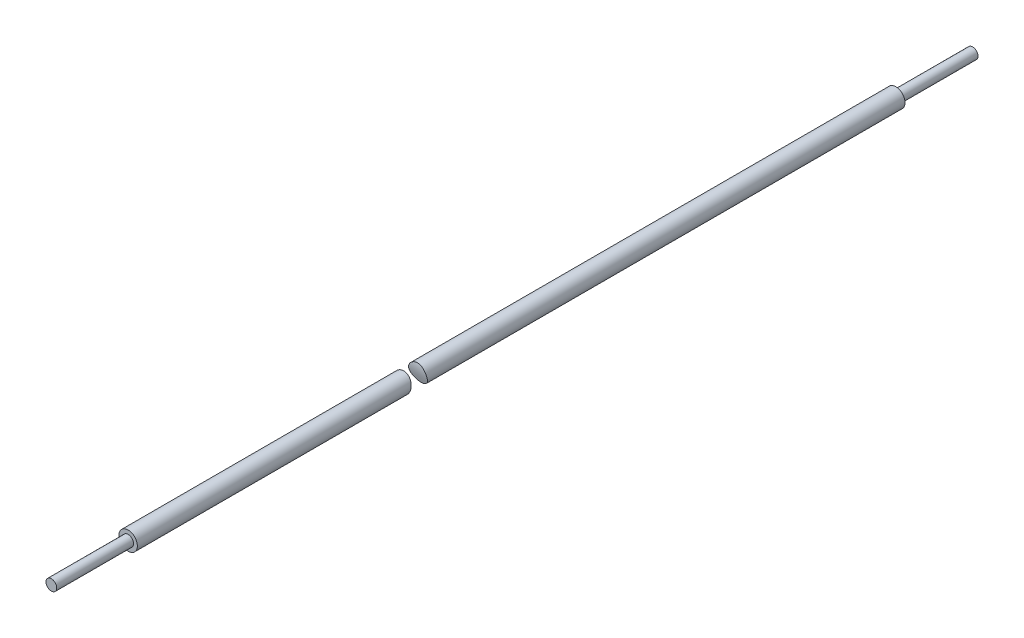
ISO-10303-21;
HEADER;
FILE_DESCRIPTION(('STEP AP214'),'2;1');
FILE_NAME('part.step','',(''),(''),'','','');
FILE_SCHEMA(('AUTOMOTIVE_DESIGN { 1 0 10303 214 1 1 1 1 }'));
ENDSEC;
DATA;
#1=APPLICATION_CONTEXT('core data for automotive mechanical design processes');
#2=APPLICATION_PROTOCOL_DEFINITION('international standard','automotive_design',2000,#1);
#3=PRODUCT_CONTEXT('',#1,'mechanical');
#4=PRODUCT('Part','Part','',(#3));
#5=PRODUCT_RELATED_PRODUCT_CATEGORY('part','',(#4));
#6=PRODUCT_DEFINITION_FORMATION('','',#4);
#7=PRODUCT_DEFINITION_CONTEXT('part definition',#1,'design');
#8=PRODUCT_DEFINITION('design','',#6,#7);
#9=PRODUCT_DEFINITION_SHAPE('','',#8);
#10=(LENGTH_UNIT() NAMED_UNIT(*) SI_UNIT(.MILLI.,.METRE.));
#11=(NAMED_UNIT(*) PLANE_ANGLE_UNIT() SI_UNIT($,.RADIAN.));
#12=(NAMED_UNIT(*) SI_UNIT($,.STERADIAN.) SOLID_ANGLE_UNIT());
#13=UNCERTAINTY_MEASURE_WITH_UNIT(LENGTH_MEASURE(1.E-05),#10,'distance_accuracy_value','');
#14=(GEOMETRIC_REPRESENTATION_CONTEXT(3) GLOBAL_UNCERTAINTY_ASSIGNED_CONTEXT((#13)) GLOBAL_UNIT_ASSIGNED_CONTEXT((#10,
#11,#12)) REPRESENTATION_CONTEXT('',''));
#15=CARTESIAN_POINT('',(0.,0.,0.));
#16=DIRECTION('',(0.,0.,1.));
#17=DIRECTION('',(1.,0.,0.));
#18=AXIS2_PLACEMENT_3D('',#15,#16,#17);
#19=CARTESIAN_POINT('',(0.,0.,55.));
#20=DIRECTION('',(0.,0.,-1.));
#21=DIRECTION('',(-1.,0.,0.));
#22=AXIS2_PLACEMENT_3D('',#19,#20,#21);
#23=CYLINDRICAL_SURFACE('',#22,0.6);
#24=CARTESIAN_POINT('',(-0.6,0.,37.1733317173384));
#25=CARTESIAN_POINT('',(-0.600004525467616,-0.0338651337145569,37.1793483798599));
#26=CARTESIAN_POINT('',(-0.597130572524053,-0.0677346568071203,37.1851827525197));
#27=CARTESIAN_POINT('',(-0.585682457596939,-0.134634639126042,37.1963614291205));
#28=CARTESIAN_POINT('',(-0.577102335124374,-0.167664183440285,37.2017052139589));
#29=CARTESIAN_POINT('',(-0.554431977455658,-0.231873173386263,37.2117822651372));
#30=CARTESIAN_POINT('',(-0.540341580982496,-0.263052564836182,37.2165155136023));
#31=CARTESIAN_POINT('',(-0.507020731987781,-0.322636930956548,37.2252997714674));
#32=CARTESIAN_POINT('',(-0.487790846485467,-0.351042211211827,37.2293508560476));
#33=CARTESIAN_POINT('',(-0.444929734405958,-0.403962705532079,37.2366968839639));
#34=CARTESIAN_POINT('',(-0.421342818865664,-0.428512846724328,37.239998753543));
#35=CARTESIAN_POINT('',(-0.370308659765615,-0.47331193469745,37.2458850595196));
#36=CARTESIAN_POINT('',(-0.342861479302813,-0.493560951767647,37.2484695076416));
#37=CARTESIAN_POINT('',(-0.285180623705258,-0.528966909294355,37.2529053955339));
#38=CARTESIAN_POINT('',(-0.254977049485698,-0.544172029327419,37.2547638028313));
#39=CARTESIAN_POINT('',(-0.192417728055219,-0.569308061664749,37.25779780415));
#40=CARTESIAN_POINT('',(-0.160062052647987,-0.579239149835,37.2589734209395));
#41=CARTESIAN_POINT('',(-0.0942952728697688,-0.593493718280629,37.2606513186643));
#42=CARTESIAN_POINT('',(-0.0608904096654577,-0.597845606225986,37.2611570111032));
#43=CARTESIAN_POINT('',(0.00618012538230546,-0.600906571997286,37.2615133029199));
#44=CARTESIAN_POINT('',(0.0398457932837287,-0.599615734946808,37.26136391218));
#45=CARTESIAN_POINT('',(0.106422890381322,-0.591436520525741,37.2604086833749));
#46=CARTESIAN_POINT('',(0.13933548994765,-0.584557535527025,37.2596039467874));
#47=CARTESIAN_POINT('',(0.20353191895032,-0.565417220680968,37.2573289163378));
#48=CARTESIAN_POINT('',(0.234815753807761,-0.553155908749178,37.2558586246911));
#49=CARTESIAN_POINT('',(0.294895386410001,-0.523601310215092,37.2522365150583));
#50=CARTESIAN_POINT('',(0.323689242092261,-0.506304140991916,37.2500841710997));
#51=CARTESIAN_POINT('',(0.37795577342849,-0.467191761513904,37.245086722159));
#52=CARTESIAN_POINT('',(0.403428424166026,-0.445376517366623,37.2422416119801));
#53=CARTESIAN_POINT('',(0.450438060321485,-0.397779483499181,37.2358466476571));
#54=CARTESIAN_POINT('',(0.471960141426715,-0.371983322088022,37.2322942259658));
#55=CARTESIAN_POINT('',(0.510370915551115,-0.317237756018339,37.2245114901094));
#56=CARTESIAN_POINT('',(0.52725945990738,-0.288288250229188,37.220281154201));
#57=CARTESIAN_POINT('',(0.556080281164799,-0.22782712080695,37.2111538314875));
#58=CARTESIAN_POINT('',(0.567971829817509,-0.196296854107105,37.2062517825329));
#59=CARTESIAN_POINT('',(0.586309852703987,-0.131779047820697,37.1958895671013));
#60=CARTESIAN_POINT('',(0.592755979263523,-0.0987914153270771,37.1904293650128));
#61=CARTESIAN_POINT('',(0.60010697653926,-0.0318918614392341,37.179002827834));
#62=CARTESIAN_POINT('',(0.600946616081725,0.00202634526350402,37.1730313506449));
#63=CARTESIAN_POINT('',(0.5969189020543,0.0695152740012249,37.1607885870037));
#64=CARTESIAN_POINT('',(0.592043426986954,0.103085432981083,37.154516886077));
#65=CARTESIAN_POINT('',(0.576635374538751,0.169292999071612,37.1418016411883));
#66=CARTESIAN_POINT('',(0.566037973964909,0.201915113230866,37.1353569484515));
#67=CARTESIAN_POINT('',(0.5394393325947,0.264903828847159,37.1225976767328));
#68=CARTESIAN_POINT('',(0.523438117937136,0.295270441213425,37.1162830971218));
#69=CARTESIAN_POINT('',(0.486380409813918,0.353009251146488,37.1040122622426));
#70=CARTESIAN_POINT('',(0.465303659334717,0.38036879324697,37.0980575655538));
#71=CARTESIAN_POINT('',(0.418726169583563,0.431105953665279,37.0868115258267));
#72=CARTESIAN_POINT('',(0.393232221247398,0.454489576737906,37.081519185693));
#73=CARTESIAN_POINT('',(0.338831657773446,0.496343035351602,37.0719101801299));
#74=CARTESIAN_POINT('',(0.309970630626879,0.514869509693084,37.0675823658502));
#75=CARTESIAN_POINT('',(0.249399782224735,0.546782383061124,37.0600520370581));
#76=CARTESIAN_POINT('',(0.217690423327152,0.560169614465975,37.056849340323));
#77=CARTESIAN_POINT('',(0.153177437289938,0.58108310374665,37.0518169351162));
#78=CARTESIAN_POINT('',(0.12042135333087,0.588748230724481,37.0499547373395));
#79=CARTESIAN_POINT('',(0.0540425838486346,0.598501673352677,37.0475815442426));
#80=CARTESIAN_POINT('',(0.0204200187814517,0.60059075999235,37.0470703621201));
#81=CARTESIAN_POINT('',(-0.0460149885015926,0.599136435546232,37.0474252656031));
#82=CARTESIAN_POINT('',(-0.078830110040821,0.595705601104681,37.0482638239241));
#83=CARTESIAN_POINT('',(-0.143399936691521,0.583537294286386,37.0512188825558));
#84=CARTESIAN_POINT('',(-0.175154655485909,0.57479989041094,37.0533353663701));
#85=CARTESIAN_POINT('',(-0.236741060853135,0.552294568542862,37.0587317698235));
#86=CARTESIAN_POINT('',(-0.266571596475177,0.53852367199709,37.0620123782961));
#87=CARTESIAN_POINT('',(-0.323497511728375,0.506377494419463,37.0695665564144));
#88=CARTESIAN_POINT('',(-0.350592735429002,0.488001951100558,37.0738401826226));
#89=CARTESIAN_POINT('',(-0.40187956101503,0.446763194393281,37.0832704976395));
#90=CARTESIAN_POINT('',(-0.426000823355403,0.423816238551091,37.0884433922942));
#91=CARTESIAN_POINT('',(-0.470075005706873,0.37433669719959,37.0993735268224));
#92=CARTESIAN_POINT('',(-0.490027073236281,0.347803380204426,37.1051308858454));
#93=CARTESIAN_POINT('',(-0.525713754642048,0.291157667579481,37.1171425833227));
#94=CARTESIAN_POINT('',(-0.541328741275547,0.260971638875823,37.1234058162036));
#95=CARTESIAN_POINT('',(-0.567233966304976,0.198472285250983,37.136041255926));
#96=CARTESIAN_POINT('',(-0.577529708800087,0.166161198435918,37.1424133430464));
#97=CARTESIAN_POINT('',(-0.594952793641682,0.0895723510468795,37.15709757146));
#98=CARTESIAN_POINT('',(-0.599994014618031,0.0447900146268163,37.1653740814817));
#99=CARTESIAN_POINT('',(-0.6,0.,37.1733317173384));
#100=B_SPLINE_CURVE_WITH_KNOTS('',3,(#24,#25,#26,#27,#28,#29,#30,#31,#32,#33,#34,#35,#36,#37,
#38,#39,#40,#41,#42,#43,#44,#45,#46,#47,#48,#49,#50,#51,#52,#53,#54,#55,#56,#57,#58,#59,#60,#61,
#62,#63,#64,#65,#66,#67,#68,#69,#70,#71,#72,#73,#74,#75,#76,#77,#78,#79,#80,#81,#82,#83,#84,#85,
#86,#87,#88,#89,#90,#91,#92,#93,#94,#95,#96,#97,#98,#99),.UNSPECIFIED.,.T.,.F.,(4,2,2,2,2,2,2,2,
2,2,2,2,2,2,2,2,2,2,2,2,2,2,2,2,2,2,2,2,2,2,2,2,2,2,2,2,2,4),(0.,0.103017742944506,
0.206143264425903,0.309271804454244,0.412388971417134,0.514510034458556,0.616629428500736,
0.717743224325473,0.818853648233888,0.919447175400059,1.02003918506336,1.12046247200139,
1.22088542467418,1.32138600891587,1.42188734709237,1.52276038499897,1.62363665894887,
1.72531988985748,1.82700961245163,1.92988045852246,2.03289766721369,2.13710721560618,
2.24131625993363,2.34594831552727,2.45042091595923,2.55361483627106,2.65679203570456,
2.75737565428702,2.8579453646285,2.95648986356784,3.05503309044568,3.15363472461673,
3.25224197655045,3.35285662684116,3.45349182987702,3.55667607867554,3.65975334242624,
3.79600457510106),.UNSPECIFIED.);
#101=CARTESIAN_POINT('',(-0.6,0.,37.1733317173384));
#102=VERTEX_POINT('',#101);
#103=EDGE_CURVE('E57',#102,#102,#100,.T.);
#104=ORIENTED_EDGE('',*,*,#103,.T.);
#105=EDGE_LOOP('',(#104));
#106=FACE_BOUND('',#105,.T.);
#107=CARTESIAN_POINT('',(0.,0.,55.));
#108=DIRECTION('',(0.,0.,1.));
#109=DIRECTION('',(1.,0.,0.));
#110=AXIS2_PLACEMENT_3D('',#107,#108,#109);
#111=CIRCLE('',#110,0.6);
#112=CARTESIAN_POINT('',(0.6,0.,55.));
#113=VERTEX_POINT('',#112);
#114=EDGE_CURVE('E53',#113,#113,#111,.T.);
#115=ORIENTED_EDGE('',*,*,#114,.F.);
#116=EDGE_LOOP('',(#115));
#117=FACE_BOUND('',#116,.T.);
#118=ADVANCED_FACE('F37',(#106,#117),#23,.T.);
#119=CARTESIAN_POINT('',(0.,0.,55.));
#120=DIRECTION('',(0.,0.,1.));
#121=DIRECTION('',(1.,0.,0.));
#122=AXIS2_PLACEMENT_3D('',#119,#120,#121);
#123=PLANE('',#122);
#124=ORIENTED_EDGE('',*,*,#114,.T.);
#125=EDGE_LOOP('',(#124));
#126=FACE_BOUND('',#125,.T.);
#127=CARTESIAN_POINT('',(0.,0.,55.));
#128=DIRECTION('',(0.,0.,1.));
#129=DIRECTION('',(1.,0.,0.));
#130=AXIS2_PLACEMENT_3D('',#127,#128,#129);
#131=CIRCLE('',#130,0.35);
#132=CARTESIAN_POINT('',(0.35,0.,55.));
#133=VERTEX_POINT('',#132);
#134=EDGE_CURVE('E48',#133,#133,#131,.T.);
#135=ORIENTED_EDGE('',*,*,#134,.F.);
#136=EDGE_LOOP('',(#135));
#137=FACE_BOUND('',#136,.T.);
#138=ADVANCED_FACE('F64',(#126,#137),#123,.T.);
#139=CARTESIAN_POINT('',(0.,0.,60.));
#140=DIRECTION('',(0.,0.,-1.));
#141=DIRECTION('',(-1.,0.,0.));
#142=AXIS2_PLACEMENT_3D('',#139,#140,#141);
#143=CYLINDRICAL_SURFACE('',#142,0.35);
#144=CARTESIAN_POINT('',(0.,0.,60.));
#145=DIRECTION('',(0.,0.,1.));
#146=DIRECTION('',(1.,0.,0.));
#147=AXIS2_PLACEMENT_3D('',#144,#145,#146);
#148=CIRCLE('',#147,0.35);
#149=CARTESIAN_POINT('',(0.35,0.,60.));
#150=VERTEX_POINT('',#149);
#151=EDGE_CURVE('E11',#150,#150,#148,.T.);
#152=ORIENTED_EDGE('',*,*,#151,.F.);
#153=EDGE_LOOP('',(#152));
#154=FACE_BOUND('',#153,.T.);
#155=ORIENTED_EDGE('',*,*,#134,.T.);
#156=EDGE_LOOP('',(#155));
#157=FACE_BOUND('',#156,.T.);
#158=ADVANCED_FACE('F69',(#154,#157),#143,.T.);
#159=CARTESIAN_POINT('',(0.,0.,60.));
#160=DIRECTION('',(0.,0.,1.));
#161=DIRECTION('',(1.,0.,0.));
#162=AXIS2_PLACEMENT_3D('',#159,#160,#161);
#163=PLANE('',#162);
#164=ORIENTED_EDGE('',*,*,#151,.T.);
#165=EDGE_LOOP('',(#164));
#166=FACE_BOUND('',#165,.T.);
#167=ADVANCED_FACE('F66',(#166),#163,.T.);
#168=CARTESIAN_POINT('',(-5.,-3.4230641409106,36.547025589897));
#169=CARTESIAN_POINT('',(-5.,-3.14339171076138,36.1789747782033));
#170=CARTESIAN_POINT('',(-5.,-1.27036221217754,35.2640775016491));
#171=CARTESIAN_POINT('',(-5.,1.09995385302857,37.2574356954973));
#172=CARTESIAN_POINT('',(-5.,4.23049440186734,32.2635733502658));
#173=CARTESIAN_POINT('',(-5.,3.60215901088681,37.7560312995749));
#174=CARTESIAN_POINT('',(-5.,-4.3520814464626,37.769618654231));
#175=CARTESIAN_POINT('',(-5.,-3.4230641409106,36.547025589897));
#176=B_SPLINE_CURVE_WITH_KNOTS('',3,(#168,#169,#170,#171,#172,#173,#174,#175),.UNSPECIFIED.,.T.,
.F.,(4,1,1,1,1,4),(0.,0.131149444938763,0.250024537159871,0.492351259368445,0.564347104587177,
1.),.UNSPECIFIED.);
#177=DIRECTION('',(1.,0.,0.));
#178=VECTOR('',#177,1.);
#179=SURFACE_OF_LINEAR_EXTRUSION('',#176,#178);
#180=ORIENTED_EDGE('',*,*,#103,.F.);
#181=EDGE_LOOP('',(#180));
#182=FACE_BOUND('',#181,.T.);
#183=ADVANCED_FACE('F39',(#182),#179,.F.);
#184=CLOSED_SHELL('',(#118,#138,#158,#167,#183));
#185=MANIFOLD_SOLID_BREP('B2',#184);
#186=CARTESIAN_POINT('',(0.,0.,0.));
#187=DIRECTION('',(0.,0.,1.));
#188=DIRECTION('',(1.,0.,0.));
#189=AXIS2_PLACEMENT_3D('',#186,#187,#188);
#190=PLANE('',#189);
#191=CARTESIAN_POINT('',(0.,0.,0.));
#192=DIRECTION('',(0.,0.,1.));
#193=DIRECTION('',(1.,0.,0.));
#194=AXIS2_PLACEMENT_3D('',#191,#192,#193);
#195=CIRCLE('',#194,0.35);
#196=CARTESIAN_POINT('',(0.35,0.,0.));
#197=VERTEX_POINT('',#196);
#198=EDGE_CURVE('E131',#197,#197,#195,.T.);
#199=ORIENTED_EDGE('',*,*,#198,.F.);
#200=EDGE_LOOP('',(#199));
#201=FACE_BOUND('',#200,.T.);
#202=ADVANCED_FACE('F119',(#201),#190,.F.);
#203=CARTESIAN_POINT('',(0.,0.,5.));
#204=DIRECTION('',(0.,0.,-1.));
#205=DIRECTION('',(-1.,0.,0.));
#206=AXIS2_PLACEMENT_3D('',#203,#204,#205);
#207=CYLINDRICAL_SURFACE('',#206,0.35);
#208=CARTESIAN_POINT('',(0.,0.,5.));
#209=DIRECTION('',(0.,0.,1.));
#210=DIRECTION('',(1.,0.,0.));
#211=AXIS2_PLACEMENT_3D('',#208,#209,#210);
#212=CIRCLE('',#211,0.35);
#213=CARTESIAN_POINT('',(0.35,0.,5.));
#214=VERTEX_POINT('',#213);
#215=EDGE_CURVE('E36',#214,#214,#212,.T.);
#216=ORIENTED_EDGE('',*,*,#215,.F.);
#217=EDGE_LOOP('',(#216));
#218=FACE_BOUND('',#217,.T.);
#219=ORIENTED_EDGE('',*,*,#198,.T.);
#220=EDGE_LOOP('',(#219));
#221=FACE_BOUND('',#220,.T.);
#222=ADVANCED_FACE('F121',(#218,#221),#207,.T.);
#223=CARTESIAN_POINT('',(0.,0.,5.));
#224=DIRECTION('',(0.,0.,1.));
#225=DIRECTION('',(1.,0.,0.));
#226=AXIS2_PLACEMENT_3D('',#223,#224,#225);
#227=PLANE('',#226);
#228=CARTESIAN_POINT('',(0.,0.,5.));
#229=DIRECTION('',(0.,0.,1.));
#230=DIRECTION('',(1.,0.,0.));
#231=AXIS2_PLACEMENT_3D('',#228,#229,#230);
#232=CIRCLE('',#231,0.6);
#233=CARTESIAN_POINT('',(0.6,0.,5.));
#234=VERTEX_POINT('',#233);
#235=EDGE_CURVE('E135',#234,#234,#232,.T.);
#236=ORIENTED_EDGE('',*,*,#235,.F.);
#237=EDGE_LOOP('',(#236));
#238=FACE_BOUND('',#237,.T.);
#239=ORIENTED_EDGE('',*,*,#215,.T.);
#240=EDGE_LOOP('',(#239));
#241=FACE_BOUND('',#240,.T.);
#242=ADVANCED_FACE('F152',(#238,#241),#227,.F.);
#243=CARTESIAN_POINT('',(0.,0.,55.));
#244=DIRECTION('',(0.,0.,-1.));
#245=DIRECTION('',(-1.,0.,0.));
#246=AXIS2_PLACEMENT_3D('',#243,#244,#245);
#247=CYLINDRICAL_SURFACE('',#246,0.6);
#248=CARTESIAN_POINT('',(-0.6,0.,36.1228417084675));
#249=CARTESIAN_POINT('',(-0.600000110972652,0.0316310183740561,36.1303139291997));
#250=CARTESIAN_POINT('',(-0.59749477515711,0.063424864659514,36.1370918942022));
#251=CARTESIAN_POINT('',(-0.587376145797788,0.126524872413695,36.1488371791633));
#252=CARTESIAN_POINT('',(-0.579766179777641,0.157831337994121,36.1538056753957));
#253=CARTESIAN_POINT('',(-0.55949690705919,0.219103167935693,36.161727606711));
#254=CARTESIAN_POINT('',(-0.546828309624659,0.249065951220957,36.1646773068472));
#255=CARTESIAN_POINT('',(-0.51674194690974,0.306648282433375,36.1686194063533));
#256=CARTESIAN_POINT('',(-0.499323374832719,0.334267431241698,36.1696114729775));
#257=CARTESIAN_POINT('',(-0.460662101087126,0.385752260395495,36.1699916497663));
#258=CARTESIAN_POINT('',(-0.439510299303365,0.409686225770991,36.1694140011498));
#259=CARTESIAN_POINT('',(-0.393670369035213,0.453916680081696,36.1672449224642));
#260=CARTESIAN_POINT('',(-0.368975579648761,0.474206151731384,36.1656515629567));
#261=CARTESIAN_POINT('',(-0.315703749010748,0.511296605212897,36.1619764722944));
#262=CARTESIAN_POINT('',(-0.287014530650745,0.527934944803533,36.1598784268354));
#263=CARTESIAN_POINT('',(-0.227329411428432,0.556246918081126,36.1558737258416));
#264=CARTESIAN_POINT('',(-0.196337374853257,0.567928657654041,36.1539667617502));
#265=CARTESIAN_POINT('',(-0.132080204309728,0.586256100072866,36.1508178739783));
#266=CARTESIAN_POINT('',(-0.0987790608829698,0.59277898089037,36.1495923648982));
#267=CARTESIAN_POINT('',(-0.0315343653538598,0.600124372695744,36.1482042676947));
#268=CARTESIAN_POINT('',(0.00240910284244483,0.600947623134593,36.1480415416897));
#269=CARTESIAN_POINT('',(0.0693659099590842,0.596904063991789,36.1488142900233));
#270=CARTESIAN_POINT('',(0.102385289286314,0.592132764097833,36.1497313317635));
#271=CARTESIAN_POINT('',(0.16714996686059,0.577204974018237,36.1523971554039));
#272=CARTESIAN_POINT('',(0.198895081609581,0.567047711208572,36.1541460566317));
#273=CARTESIAN_POINT('',(0.260413696050906,0.541571014840063,36.1580197640141));
#274=CARTESIAN_POINT('',(0.290175801984566,0.526224392212801,36.1601465214599));
#275=CARTESIAN_POINT('',(0.346750792916543,0.490793067181614,36.1641391317405));
#276=CARTESIAN_POINT('',(0.373563837838505,0.470708621889428,36.1660049987247));
#277=CARTESIAN_POINT('',(0.423797451133642,0.42607179272164,36.1688018678248));
#278=CARTESIAN_POINT('',(0.4471755541414,0.401470777811482,36.1697218951957));
#279=CARTESIAN_POINT('',(0.489452956630084,0.348680562687189,36.1699343363276));
#280=CARTESIAN_POINT('',(0.508354203431616,0.320492930793921,36.1692274591904));
#281=CARTESIAN_POINT('',(0.540500921531871,0.262520311255418,36.1658045488118));
#282=CARTESIAN_POINT('',(0.553928282455202,0.232831723840355,36.1631630977547));
#283=CARTESIAN_POINT('',(0.57575710977808,0.171903887033838,36.1558386051566));
#284=CARTESIAN_POINT('',(0.584158814904285,0.140664711374149,36.1511556606081));
#285=CARTESIAN_POINT('',(0.595708279725621,0.0782280414624332,36.1400416027465));
#286=CARTESIAN_POINT('',(0.598960060200162,0.047042782097284,36.1336482339364));
#287=CARTESIAN_POINT('',(0.600616926420775,-0.0151827865839837,36.1194375322926));
#288=CARTESIAN_POINT('',(0.599012479782223,-0.0462226908760744,36.1116174271859));
#289=CARTESIAN_POINT('',(0.590864459302665,-0.109329558437807,36.0945386747779));
#290=CARTESIAN_POINT('',(0.584022436764259,-0.141341836556596,36.0852210584424));
#291=CARTESIAN_POINT('',(0.565293954105757,-0.203726032415706,36.066163193292));
#292=CARTESIAN_POINT('',(0.553405685961283,-0.234097357816473,36.056422794122));
#293=CARTESIAN_POINT('',(0.523819796845792,-0.294665914144921,36.0364276409842));
#294=CARTESIAN_POINT('',(0.50576726392025,-0.324695080556991,36.0261859742818));
#295=CARTESIAN_POINT('',(0.464548265119985,-0.381341585814387,36.0065705438641));
#296=CARTESIAN_POINT('',(0.441381976637291,-0.407959042958523,35.9971967500589));
#297=CARTESIAN_POINT('',(0.390701314756068,-0.456701308065753,35.9799500762238));
#298=CARTESIAN_POINT('',(0.363230993306049,-0.478866937985404,35.9720636030104));
#299=CARTESIAN_POINT('',(0.304507155976111,-0.518191618536726,35.9580886794682));
#300=CARTESIAN_POINT('',(0.273255127809167,-0.53535262897027,35.9519995253004));
#301=CARTESIAN_POINT('',(0.209966644056603,-0.563056040279452,35.9422012286805));
#302=CARTESIAN_POINT('',(0.17810095394462,-0.573944745070532,35.9383672384979));
#303=CARTESIAN_POINT('',(0.112833329045011,-0.590253366711986,35.9326375619664));
#304=CARTESIAN_POINT('',(0.0794318159603147,-0.595674775495117,35.9307413468294));
#305=CARTESIAN_POINT('',(0.0136788258792561,-0.600708405005608,35.9289806378951));
#306=CARTESIAN_POINT('',(-0.0186511616875288,-0.600574031313309,35.9290275175785));
#307=CARTESIAN_POINT('',(-0.0828146588848904,-0.595128560192901,35.9309325315181));
#308=CARTESIAN_POINT('',(-0.114648230061374,-0.589818109765365,35.9327904393988));
#309=CARTESIAN_POINT('',(-0.176610702386982,-0.574298861835376,35.9382428644426));
#310=CARTESIAN_POINT('',(-0.20675302074255,-0.564137514593359,35.9418205613613));
#311=CARTESIAN_POINT('',(-0.264859249263413,-0.539303406718391,35.9506007155145));
#312=CARTESIAN_POINT('',(-0.292823021964533,-0.524630361690077,35.9558032751728));
#313=CARTESIAN_POINT('',(-0.34652287784246,-0.490868224383199,35.9677971508914));
#314=CARTESIAN_POINT('',(-0.372190403086359,-0.471682656200618,35.9746232189183));
#315=CARTESIAN_POINT('',(-0.419961916549943,-0.429702224350536,35.9895128742234));
#316=CARTESIAN_POINT('',(-0.442065133085156,-0.406906581201774,35.9975767287507));
#317=CARTESIAN_POINT('',(-0.483363686271521,-0.357020349666255,36.0150286541983));
#318=CARTESIAN_POINT('',(-0.502339788421876,-0.329765088638002,36.0244645246959));
#319=CARTESIAN_POINT('',(-0.53554075640808,-0.272567032059488,36.0437938696342));
#320=CARTESIAN_POINT('',(-0.549754590596234,-0.24261819754886,36.0536883469409));
#321=CARTESIAN_POINT('',(-0.574080258631672,-0.178099200167223,36.0741495976347));
#322=CARTESIAN_POINT('',(-0.583739720547852,-0.143352678005848,36.0847018724189));
#323=CARTESIAN_POINT('',(-0.596692021551645,-0.0724734431726205,36.1047539017137));
#324=CARTESIAN_POINT('',(-0.599999872491843,-0.036344205349381,36.114256087812));
#325=CARTESIAN_POINT('',(-0.6,0.,36.1228417084675));
#326=B_SPLINE_CURVE_WITH_KNOTS('',3,(#248,#249,#250,#251,#252,#253,#254,#255,#256,#257,#258,
#259,#260,#261,#262,#263,#264,#265,#266,#267,#268,#269,#270,#271,#272,#273,#274,#275,#276,#277,
#278,#279,#280,#281,#282,#283,#284,#285,#286,#287,#288,#289,#290,#291,#292,#293,#294,#295,#296,
#297,#298,#299,#300,#301,#302,#303,#304,#305,#306,#307,#308,#309,#310,#311,#312,#313,#314,#315,
#316,#317,#318,#319,#320,#321,#322,#323,#324,#325),.UNSPECIFIED.,.T.,.F.,(4,2,2,2,2,2,2,2,2,2,2,
2,2,2,2,2,2,2,2,2,2,2,2,2,2,2,2,2,2,2,2,2,2,2,2,2,2,2,4),(0.,0.0973880391860924,
0.194712656248781,0.292216848998834,0.389737613438552,0.485148267455086,0.58074070527567,
0.679980499467571,0.77905736822154,0.880427462691702,0.981784405498439,1.08143588395504,
1.18110166142646,1.28129793286906,1.38148876811967,1.48282944500984,1.58412595995067,
1.68171009917575,1.77928960263059,1.87487179263658,1.97064172441711,2.07231687359894,
2.17402848286187,2.28302037030203,2.39200847749608,2.49994631267373,2.60784182261521,
2.70900167517652,2.81013391544658,2.90665871803399,3.00317145673638,3.09875889460378,
3.19435235907142,3.29221286063047,3.39009452094412,3.49322023576645,3.59658321263727,
3.70874800460169,3.82064737037288),.UNSPECIFIED.);
#327=CARTESIAN_POINT('',(-0.6,0.,36.1228417084675));
#328=VERTEX_POINT('',#327);
#329=EDGE_CURVE('E123',#328,#328,#326,.T.);
#330=ORIENTED_EDGE('',*,*,#329,.T.);
#331=EDGE_LOOP('',(#330));
#332=FACE_BOUND('',#331,.T.);
#333=ORIENTED_EDGE('',*,*,#235,.T.);
#334=EDGE_LOOP('',(#333));
#335=FACE_BOUND('',#334,.T.);
#336=ADVANCED_FACE('F150',(#332,#335),#247,.T.);
#337=CARTESIAN_POINT('',(-5.,-3.4230641409106,36.547025589897));
#338=CARTESIAN_POINT('',(-5.,-3.14339171076138,36.1789747782033));
#339=CARTESIAN_POINT('',(-5.,-1.27036221217754,35.2640775016491));
#340=CARTESIAN_POINT('',(-5.,1.09995385302857,37.2574356954973));
#341=CARTESIAN_POINT('',(-5.,4.23049440186734,32.2635733502658));
#342=CARTESIAN_POINT('',(-5.,3.60215901088681,37.7560312995749));
#343=CARTESIAN_POINT('',(-5.,-4.3520814464626,37.769618654231));
#344=CARTESIAN_POINT('',(-5.,-3.4230641409106,36.547025589897));
#345=B_SPLINE_CURVE_WITH_KNOTS('',3,(#337,#338,#339,#340,#341,#342,#343,#344),.UNSPECIFIED.,.T.,
.F.,(4,1,1,1,1,4),(0.,0.131149444938763,0.250024537159871,0.492351259368445,0.564347104587177,
1.),.UNSPECIFIED.);
#346=DIRECTION('',(1.,0.,0.));
#347=VECTOR('',#346,1.);
#348=SURFACE_OF_LINEAR_EXTRUSION('',#345,#347);
#349=ORIENTED_EDGE('',*,*,#329,.F.);
#350=EDGE_LOOP('',(#349));
#351=FACE_BOUND('',#350,.T.);
#352=ADVANCED_FACE('F146',(#351),#348,.F.);
#353=CLOSED_SHELL('',(#202,#222,#242,#336,#352));
#354=MANIFOLD_SOLID_BREP('B6',#353);
#355=ADVANCED_BREP_SHAPE_REPRESENTATION('',(#18,#185,#354),#14);
#356=SHAPE_DEFINITION_REPRESENTATION(#9,#355);
ENDSEC;
END-ISO-10303-21;
